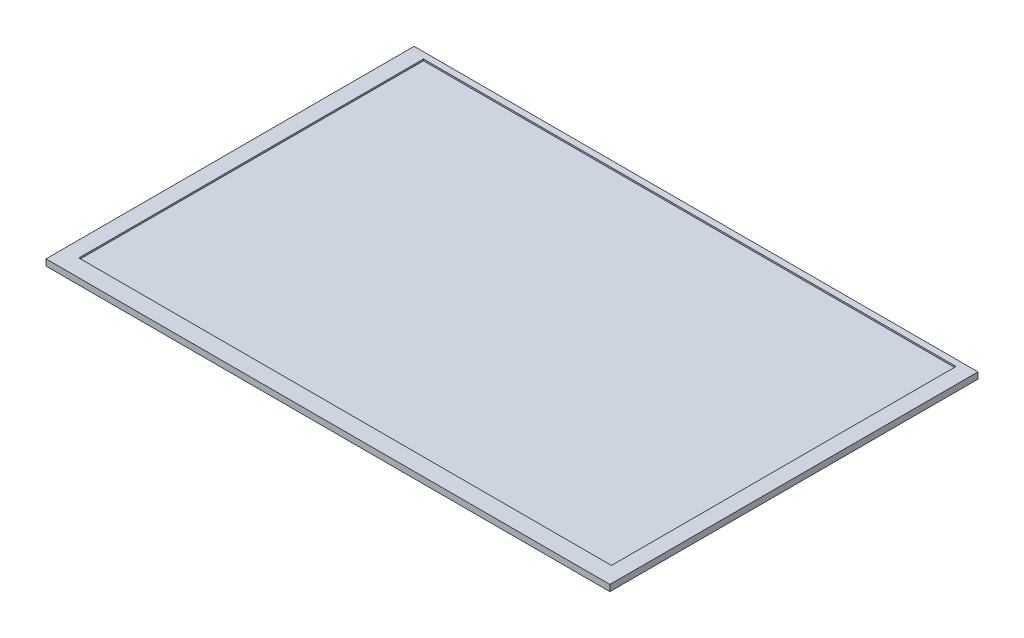
ISO-10303-21;
HEADER;
FILE_DESCRIPTION(('STEP AP214'),'2;1');
FILE_NAME('part.step','',(''),(''),'','','');
FILE_SCHEMA(('AUTOMOTIVE_DESIGN { 1 0 10303 214 1 1 1 1 }'));
ENDSEC;
DATA;
#1=APPLICATION_CONTEXT('core data for automotive mechanical design processes');
#2=APPLICATION_PROTOCOL_DEFINITION('international standard','automotive_design',2000,#1);
#3=PRODUCT_CONTEXT('',#1,'mechanical');
#4=PRODUCT('Part','Part','',(#3));
#5=PRODUCT_RELATED_PRODUCT_CATEGORY('part','',(#4));
#6=PRODUCT_DEFINITION_FORMATION('','',#4);
#7=PRODUCT_DEFINITION_CONTEXT('part definition',#1,'design');
#8=PRODUCT_DEFINITION('design','',#6,#7);
#9=PRODUCT_DEFINITION_SHAPE('','',#8);
#10=(LENGTH_UNIT() NAMED_UNIT(*) SI_UNIT(.MILLI.,.METRE.));
#11=(NAMED_UNIT(*) PLANE_ANGLE_UNIT() SI_UNIT($,.RADIAN.));
#12=(NAMED_UNIT(*) SI_UNIT($,.STERADIAN.) SOLID_ANGLE_UNIT());
#13=UNCERTAINTY_MEASURE_WITH_UNIT(LENGTH_MEASURE(1.E-05),#10,'distance_accuracy_value','');
#14=(GEOMETRIC_REPRESENTATION_CONTEXT(3) GLOBAL_UNCERTAINTY_ASSIGNED_CONTEXT((#13)) GLOBAL_UNIT_ASSIGNED_CONTEXT((#10,
#11,#12)) REPRESENTATION_CONTEXT('',''));
#15=CARTESIAN_POINT('',(0.,0.,0.));
#16=DIRECTION('',(0.,0.,1.));
#17=DIRECTION('',(1.,0.,0.));
#18=AXIS2_PLACEMENT_3D('',#15,#16,#17);
#19=CARTESIAN_POINT('',(-114.3,2.54,74.6125));
#20=DIRECTION('',(0.,0.,-1.));
#21=DIRECTION('',(-1.,0.,0.));
#22=AXIS2_PLACEMENT_3D('',#19,#20,#21);
#23=PLANE('',#22);
#24=DIRECTION('',(1.,0.,0.));
#25=VECTOR('',#24,1.);
#26=CARTESIAN_POINT('',(-114.3,0.,74.6125));
#27=LINE('',#26,#25);
#28=CARTESIAN_POINT('',(-114.3,0.,74.6125));
#29=VERTEX_POINT('',#28);
#30=CARTESIAN_POINT('',(114.3,0.,74.6125));
#31=VERTEX_POINT('',#30);
#32=EDGE_CURVE('E141',#29,#31,#27,.T.);
#33=ORIENTED_EDGE('',*,*,#32,.T.);
#34=DIRECTION('',(0.,-1.,0.));
#35=VECTOR('',#34,1.);
#36=CARTESIAN_POINT('',(114.3,2.54,74.6125));
#37=LINE('',#36,#35);
#38=CARTESIAN_POINT('',(114.3,2.54,74.6125));
#39=VERTEX_POINT('',#38);
#40=EDGE_CURVE('E11',#39,#31,#37,.T.);
#41=ORIENTED_EDGE('',*,*,#40,.F.);
#42=DIRECTION('',(1.,0.,0.));
#43=VECTOR('',#42,1.);
#44=CARTESIAN_POINT('',(-114.3,2.54,74.6125));
#45=LINE('',#44,#43);
#46=CARTESIAN_POINT('',(-114.3,2.54,74.6125));
#47=VERTEX_POINT('',#46);
#48=EDGE_CURVE('E145',#47,#39,#45,.T.);
#49=ORIENTED_EDGE('',*,*,#48,.F.);
#50=DIRECTION('',(0.,-1.,0.));
#51=VECTOR('',#50,1.);
#52=CARTESIAN_POINT('',(-114.3,2.54,74.6125));
#53=LINE('',#52,#51);
#54=EDGE_CURVE('E57',#47,#29,#53,.T.);
#55=ORIENTED_EDGE('',*,*,#54,.T.);
#56=EDGE_LOOP('',(#33,#41,#49,#55));
#57=FACE_BOUND('',#56,.T.);
#58=ADVANCED_FACE('F34',(#57),#23,.F.);
#59=CARTESIAN_POINT('',(114.3,2.54,74.6125));
#60=DIRECTION('',(-1.,0.,0.));
#61=DIRECTION('',(0.,0.,1.));
#62=AXIS2_PLACEMENT_3D('',#59,#60,#61);
#63=PLANE('',#62);
#64=DIRECTION('',(0.,0.,-1.));
#65=VECTOR('',#64,1.);
#66=CARTESIAN_POINT('',(114.3,0.,74.6125));
#67=LINE('',#66,#65);
#68=CARTESIAN_POINT('',(114.3,0.,-74.6125));
#69=VERTEX_POINT('',#68);
#70=EDGE_CURVE('E155',#31,#69,#67,.T.);
#71=ORIENTED_EDGE('',*,*,#70,.T.);
#72=DIRECTION('',(0.,-1.,0.));
#73=VECTOR('',#72,1.);
#74=CARTESIAN_POINT('',(114.3,2.54,-74.6125));
#75=LINE('',#74,#73);
#76=CARTESIAN_POINT('',(114.3,2.54,-74.6125));
#77=VERTEX_POINT('',#76);
#78=EDGE_CURVE('E41',#77,#69,#75,.T.);
#79=ORIENTED_EDGE('',*,*,#78,.F.);
#80=DIRECTION('',(0.,0.,-1.));
#81=VECTOR('',#80,1.);
#82=CARTESIAN_POINT('',(114.3,2.54,74.6125));
#83=LINE('',#82,#81);
#84=EDGE_CURVE('E83',#39,#77,#83,.T.);
#85=ORIENTED_EDGE('',*,*,#84,.F.);
#86=ORIENTED_EDGE('',*,*,#40,.T.);
#87=EDGE_LOOP('',(#71,#79,#85,#86));
#88=FACE_BOUND('',#87,.T.);
#89=ADVANCED_FACE('F169',(#88),#63,.F.);
#90=CARTESIAN_POINT('',(-114.3,2.54,-74.6125));
#91=DIRECTION('',(0.,0.,-1.));
#92=DIRECTION('',(-1.,0.,0.));
#93=AXIS2_PLACEMENT_3D('',#90,#91,#92);
#94=PLANE('',#93);
#95=DIRECTION('',(1.,0.,0.));
#96=VECTOR('',#95,1.);
#97=CARTESIAN_POINT('',(-114.3,0.,-74.6125));
#98=LINE('',#97,#96);
#99=CARTESIAN_POINT('',(-114.3,0.,-74.6125));
#100=VERTEX_POINT('',#99);
#101=EDGE_CURVE('E158',#100,#69,#98,.T.);
#102=ORIENTED_EDGE('',*,*,#101,.F.);
#103=DIRECTION('',(0.,-1.,0.));
#104=VECTOR('',#103,1.);
#105=CARTESIAN_POINT('',(-114.3,2.54,-74.6125));
#106=LINE('',#105,#104);
#107=CARTESIAN_POINT('',(-114.3,2.54,-74.6125));
#108=VERTEX_POINT('',#107);
#109=EDGE_CURVE('E164',#108,#100,#106,.T.);
#110=ORIENTED_EDGE('',*,*,#109,.F.);
#111=DIRECTION('',(1.,0.,0.));
#112=VECTOR('',#111,1.);
#113=CARTESIAN_POINT('',(-114.3,2.54,-74.6125));
#114=LINE('',#113,#112);
#115=EDGE_CURVE('E149',#108,#77,#114,.T.);
#116=ORIENTED_EDGE('',*,*,#115,.T.);
#117=ORIENTED_EDGE('',*,*,#78,.T.);
#118=EDGE_LOOP('',(#102,#110,#116,#117));
#119=FACE_BOUND('',#118,.T.);
#120=ADVANCED_FACE('F167',(#119),#94,.T.);
#121=CARTESIAN_POINT('',(-114.3,2.54,74.6125));
#122=DIRECTION('',(-1.,0.,0.));
#123=DIRECTION('',(0.,0.,1.));
#124=AXIS2_PLACEMENT_3D('',#121,#122,#123);
#125=PLANE('',#124);
#126=DIRECTION('',(0.,0.,-1.));
#127=VECTOR('',#126,1.);
#128=CARTESIAN_POINT('',(-114.3,0.,74.6125));
#129=LINE('',#128,#127);
#130=EDGE_CURVE('E147',#29,#100,#129,.T.);
#131=ORIENTED_EDGE('',*,*,#130,.F.);
#132=ORIENTED_EDGE('',*,*,#54,.F.);
#133=DIRECTION('',(0.,0.,-1.));
#134=VECTOR('',#133,1.);
#135=CARTESIAN_POINT('',(-114.3,2.54,74.6125));
#136=LINE('',#135,#134);
#137=EDGE_CURVE('E152',#47,#108,#136,.T.);
#138=ORIENTED_EDGE('',*,*,#137,.T.);
#139=ORIENTED_EDGE('',*,*,#109,.T.);
#140=EDGE_LOOP('',(#131,#132,#138,#139));
#141=FACE_BOUND('',#140,.T.);
#142=ADVANCED_FACE('F173',(#141),#125,.T.);
#143=CARTESIAN_POINT('',(0.,2.54,0.));
#144=DIRECTION('',(0.,1.,0.));
#145=DIRECTION('',(0.,0.,1.));
#146=AXIS2_PLACEMENT_3D('',#143,#144,#145);
#147=PLANE('',#146);
#148=DIRECTION('',(0.,0.,1.));
#149=VECTOR('',#148,1.);
#150=CARTESIAN_POINT('',(-107.95,2.54,67.6275));
#151=LINE('',#150,#149);
#152=CARTESIAN_POINT('',(-107.95,2.54,-72.0725));
#153=VERTEX_POINT('',#152);
#154=CARTESIAN_POINT('',(-107.95,2.54,67.6275));
#155=VERTEX_POINT('',#154);
#156=EDGE_CURVE('E48',#153,#155,#151,.T.);
#157=ORIENTED_EDGE('',*,*,#156,.F.);
#158=DIRECTION('',(-1.,0.,0.));
#159=VECTOR('',#158,1.);
#160=CARTESIAN_POINT('',(107.95,2.54,-72.0725));
#161=LINE('',#160,#159);
#162=CARTESIAN_POINT('',(107.95,2.54,-72.0725));
#163=VERTEX_POINT('',#162);
#164=EDGE_CURVE('E126',#163,#153,#161,.T.);
#165=ORIENTED_EDGE('',*,*,#164,.F.);
#166=DIRECTION('',(0.,0.,-1.));
#167=VECTOR('',#166,1.);
#168=CARTESIAN_POINT('',(107.95,2.54,67.6275));
#169=LINE('',#168,#167);
#170=CARTESIAN_POINT('',(107.95,2.54,67.6275));
#171=VERTEX_POINT('',#170);
#172=EDGE_CURVE('E129',#171,#163,#169,.T.);
#173=ORIENTED_EDGE('',*,*,#172,.F.);
#174=DIRECTION('',(1.,0.,0.));
#175=VECTOR('',#174,1.);
#176=CARTESIAN_POINT('',(107.95,2.54,67.6275));
#177=LINE('',#176,#175);
#178=EDGE_CURVE('E135',#155,#171,#177,.T.);
#179=ORIENTED_EDGE('',*,*,#178,.F.);
#180=EDGE_LOOP('',(#157,#165,#173,#179));
#181=FACE_BOUND('',#180,.T.);
#182=ORIENTED_EDGE('',*,*,#48,.T.);
#183=ORIENTED_EDGE('',*,*,#84,.T.);
#184=ORIENTED_EDGE('',*,*,#115,.F.);
#185=ORIENTED_EDGE('',*,*,#137,.F.);
#186=EDGE_LOOP('',(#182,#183,#184,#185));
#187=FACE_BOUND('',#186,.T.);
#188=ADVANCED_FACE('F176',(#181,#187),#147,.T.);
#189=CARTESIAN_POINT('',(0.,0.,0.));
#190=DIRECTION('',(0.,1.,0.));
#191=DIRECTION('',(0.,0.,1.));
#192=AXIS2_PLACEMENT_3D('',#189,#190,#191);
#193=PLANE('',#192);
#194=ORIENTED_EDGE('',*,*,#32,.F.);
#195=ORIENTED_EDGE('',*,*,#130,.T.);
#196=ORIENTED_EDGE('',*,*,#101,.T.);
#197=ORIENTED_EDGE('',*,*,#70,.F.);
#198=EDGE_LOOP('',(#194,#195,#196,#197));
#199=FACE_BOUND('',#198,.T.);
#200=ADVANCED_FACE('F172',(#199),#193,.F.);
#201=CARTESIAN_POINT('',(-107.95,1.905,67.6275));
#202=DIRECTION('',(-1.,0.,0.));
#203=DIRECTION('',(0.,0.,1.));
#204=AXIS2_PLACEMENT_3D('',#201,#202,#203);
#205=PLANE('',#204);
#206=ORIENTED_EDGE('',*,*,#156,.T.);
#207=DIRECTION('',(0.,1.,0.));
#208=VECTOR('',#207,1.);
#209=CARTESIAN_POINT('',(-107.95,1.905,67.6275));
#210=LINE('',#209,#208);
#211=CARTESIAN_POINT('',(-107.95,1.905,67.6275));
#212=VERTEX_POINT('',#211);
#213=EDGE_CURVE('E104',#212,#155,#210,.T.);
#214=ORIENTED_EDGE('',*,*,#213,.F.);
#215=DIRECTION('',(0.,0.,1.));
#216=VECTOR('',#215,1.);
#217=CARTESIAN_POINT('',(-107.95,1.905,67.6275));
#218=LINE('',#217,#216);
#219=CARTESIAN_POINT('',(-107.95,1.905,-72.0725));
#220=VERTEX_POINT('',#219);
#221=EDGE_CURVE('E108',#220,#212,#218,.T.);
#222=ORIENTED_EDGE('',*,*,#221,.F.);
#223=DIRECTION('',(0.,1.,0.));
#224=VECTOR('',#223,1.);
#225=CARTESIAN_POINT('',(-107.95,1.905,-72.0725));
#226=LINE('',#225,#224);
#227=EDGE_CURVE('E139',#220,#153,#226,.T.);
#228=ORIENTED_EDGE('',*,*,#227,.T.);
#229=EDGE_LOOP('',(#206,#214,#222,#228));
#230=FACE_BOUND('',#229,.T.);
#231=ADVANCED_FACE('F106',(#230),#205,.F.);
#232=CARTESIAN_POINT('',(107.95,1.905,-72.0725));
#233=DIRECTION('',(0.,0.,-1.));
#234=DIRECTION('',(-1.,0.,0.));
#235=AXIS2_PLACEMENT_3D('',#232,#233,#234);
#236=PLANE('',#235);
#237=ORIENTED_EDGE('',*,*,#164,.T.);
#238=ORIENTED_EDGE('',*,*,#227,.F.);
#239=DIRECTION('',(-1.,0.,0.));
#240=VECTOR('',#239,1.);
#241=CARTESIAN_POINT('',(107.95,1.905,-72.0725));
#242=LINE('',#241,#240);
#243=CARTESIAN_POINT('',(107.95,1.905,-72.0725));
#244=VERTEX_POINT('',#243);
#245=EDGE_CURVE('E114',#244,#220,#242,.T.);
#246=ORIENTED_EDGE('',*,*,#245,.F.);
#247=DIRECTION('',(0.,1.,0.));
#248=VECTOR('',#247,1.);
#249=CARTESIAN_POINT('',(107.95,1.905,-72.0725));
#250=LINE('',#249,#248);
#251=EDGE_CURVE('E142',#244,#163,#250,.T.);
#252=ORIENTED_EDGE('',*,*,#251,.T.);
#253=EDGE_LOOP('',(#237,#238,#246,#252));
#254=FACE_BOUND('',#253,.T.);
#255=ADVANCED_FACE('F195',(#254),#236,.F.);
#256=CARTESIAN_POINT('',(107.95,1.905,67.6275));
#257=DIRECTION('',(1.,0.,0.));
#258=DIRECTION('',(0.,0.,-1.));
#259=AXIS2_PLACEMENT_3D('',#256,#257,#258);
#260=PLANE('',#259);
#261=ORIENTED_EDGE('',*,*,#172,.T.);
#262=ORIENTED_EDGE('',*,*,#251,.F.);
#263=DIRECTION('',(0.,0.,-1.));
#264=VECTOR('',#263,1.);
#265=CARTESIAN_POINT('',(107.95,1.905,67.6275));
#266=LINE('',#265,#264);
#267=CARTESIAN_POINT('',(107.95,1.905,67.6275));
#268=VERTEX_POINT('',#267);
#269=EDGE_CURVE('E122',#268,#244,#266,.T.);
#270=ORIENTED_EDGE('',*,*,#269,.F.);
#271=DIRECTION('',(0.,1.,0.));
#272=VECTOR('',#271,1.);
#273=CARTESIAN_POINT('',(107.95,1.905,67.6275));
#274=LINE('',#273,#272);
#275=EDGE_CURVE('E113',#268,#171,#274,.T.);
#276=ORIENTED_EDGE('',*,*,#275,.T.);
#277=EDGE_LOOP('',(#261,#262,#270,#276));
#278=FACE_BOUND('',#277,.T.);
#279=ADVANCED_FACE('F198',(#278),#260,.F.);
#280=CARTESIAN_POINT('',(107.95,1.905,67.6275));
#281=DIRECTION('',(0.,0.,1.));
#282=DIRECTION('',(1.,0.,0.));
#283=AXIS2_PLACEMENT_3D('',#280,#281,#282);
#284=PLANE('',#283);
#285=ORIENTED_EDGE('',*,*,#178,.T.);
#286=ORIENTED_EDGE('',*,*,#275,.F.);
#287=DIRECTION('',(1.,0.,0.));
#288=VECTOR('',#287,1.);
#289=CARTESIAN_POINT('',(107.95,1.905,67.6275));
#290=LINE('',#289,#288);
#291=EDGE_CURVE('E117',#212,#268,#290,.T.);
#292=ORIENTED_EDGE('',*,*,#291,.F.);
#293=ORIENTED_EDGE('',*,*,#213,.T.);
#294=EDGE_LOOP('',(#285,#286,#292,#293));
#295=FACE_BOUND('',#294,.T.);
#296=ADVANCED_FACE('F118',(#295),#284,.F.);
#297=CARTESIAN_POINT('',(0.,1.905,0.));
#298=DIRECTION('',(0.,1.,0.));
#299=DIRECTION('',(0.,0.,1.));
#300=AXIS2_PLACEMENT_3D('',#297,#298,#299);
#301=PLANE('',#300);
#302=ORIENTED_EDGE('',*,*,#221,.T.);
#303=ORIENTED_EDGE('',*,*,#291,.T.);
#304=ORIENTED_EDGE('',*,*,#269,.T.);
#305=ORIENTED_EDGE('',*,*,#245,.T.);
#306=EDGE_LOOP('',(#302,#303,#304,#305));
#307=FACE_BOUND('',#306,.T.);
#308=ADVANCED_FACE('F124',(#307),#301,.T.);
#309=CLOSED_SHELL('',(#58,#89,#120,#142,#188,#200,#231,#255,#279,#296,#308));
#310=MANIFOLD_SOLID_BREP('B2',#309);
#311=ADVANCED_BREP_SHAPE_REPRESENTATION('',(#18,#310),#14);
#312=SHAPE_DEFINITION_REPRESENTATION(#9,#311);
ENDSEC;
END-ISO-10303-21;
